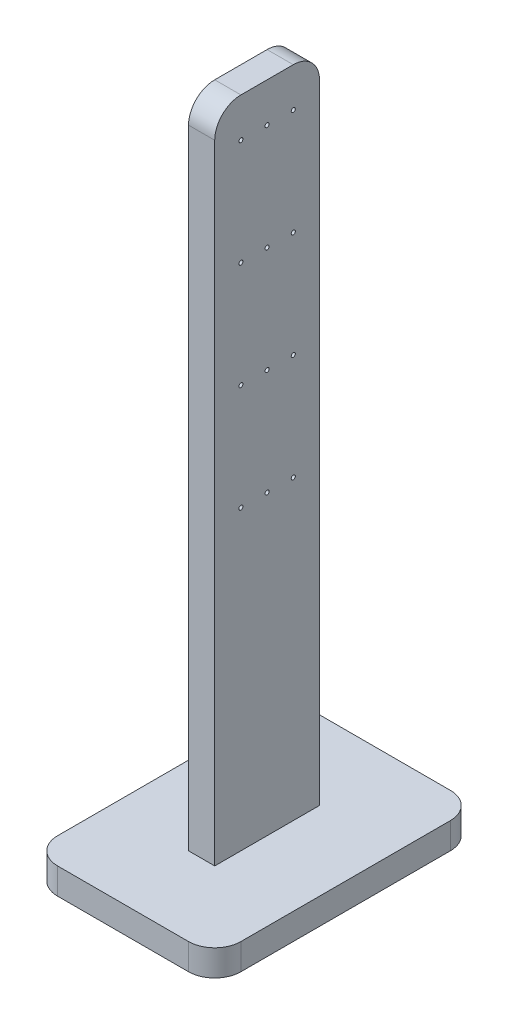
ISO-10303-21;
HEADER;
FILE_DESCRIPTION(('STEP AP214'),'2;1');
FILE_NAME('part.step','',(''),(''),'','','');
FILE_SCHEMA(('AUTOMOTIVE_DESIGN { 1 0 10303 214 1 1 1 1 }'));
ENDSEC;
DATA;
#1=APPLICATION_CONTEXT('core data for automotive mechanical design processes');
#2=APPLICATION_PROTOCOL_DEFINITION('international standard','automotive_design',2000,#1);
#3=PRODUCT_CONTEXT('',#1,'mechanical');
#4=PRODUCT('Part','Part','',(#3));
#5=PRODUCT_RELATED_PRODUCT_CATEGORY('part','',(#4));
#6=PRODUCT_DEFINITION_FORMATION('','',#4);
#7=PRODUCT_DEFINITION_CONTEXT('part definition',#1,'design');
#8=PRODUCT_DEFINITION('design','',#6,#7);
#9=PRODUCT_DEFINITION_SHAPE('','',#8);
#10=(LENGTH_UNIT() NAMED_UNIT(*) SI_UNIT(.MILLI.,.METRE.));
#11=(NAMED_UNIT(*) PLANE_ANGLE_UNIT() SI_UNIT($,.RADIAN.));
#12=(NAMED_UNIT(*) SI_UNIT($,.STERADIAN.) SOLID_ANGLE_UNIT());
#13=UNCERTAINTY_MEASURE_WITH_UNIT(LENGTH_MEASURE(1.E-05),#10,'distance_accuracy_value','');
#14=(GEOMETRIC_REPRESENTATION_CONTEXT(3) GLOBAL_UNCERTAINTY_ASSIGNED_CONTEXT((#13)) GLOBAL_UNIT_ASSIGNED_CONTEXT((#10,
#11,#12)) REPRESENTATION_CONTEXT('',''));
#15=CARTESIAN_POINT('',(0.,0.,0.));
#16=DIRECTION('',(0.,0.,1.));
#17=DIRECTION('',(1.,0.,0.));
#18=AXIS2_PLACEMENT_3D('',#15,#16,#17);
#19=CARTESIAN_POINT('',(10.,240.,-10.));
#20=DIRECTION('',(-1.,0.,0.));
#21=DIRECTION('',(0.,0.,1.));
#22=AXIS2_PLACEMENT_3D('',#19,#20,#21);
#23=PLANE('',#22);
#24=DIRECTION('',(0.,-1.,0.));
#25=VECTOR('',#24,1.);
#26=CARTESIAN_POINT('',(10.,0.,0.));
#27=LINE('',#26,#25);
#28=CARTESIAN_POINT('',(10.,240.,0.));
#29=VERTEX_POINT('',#28);
#30=CARTESIAN_POINT('',(10.,0.,0.));
#31=VERTEX_POINT('',#30);
#32=EDGE_CURVE('E90',#29,#31,#27,.T.);
#33=ORIENTED_EDGE('',*,*,#32,.T.);
#34=DIRECTION('',(0.,0.,-1.));
#35=VECTOR('',#34,1.);
#36=CARTESIAN_POINT('',(10.,0.,0.));
#37=LINE('',#36,#35);
#38=CARTESIAN_POINT('',(10.,0.,-40.));
#39=VERTEX_POINT('',#38);
#40=EDGE_CURVE('E150',#31,#39,#37,.T.);
#41=ORIENTED_EDGE('',*,*,#40,.T.);
#42=DIRECTION('',(0.,1.,0.));
#43=VECTOR('',#42,1.);
#44=CARTESIAN_POINT('',(10.,0.,-40.));
#45=LINE('',#44,#43);
#46=CARTESIAN_POINT('',(10.,240.,-40.));
#47=VERTEX_POINT('',#46);
#48=EDGE_CURVE('E106',#39,#47,#45,.T.);
#49=ORIENTED_EDGE('',*,*,#48,.T.);
#50=CARTESIAN_POINT('',(10.,240.,-30.));
#51=DIRECTION('',(1.,0.,0.));
#52=DIRECTION('',(0.,0.,1.));
#53=AXIS2_PLACEMENT_3D('',#50,#51,#52);
#54=CIRCLE('',#53,10.);
#55=CARTESIAN_POINT('',(10.,250.,-29.9999999999999));
#56=VERTEX_POINT('',#55);
#57=EDGE_CURVE('E100',#47,#56,#54,.T.);
#58=ORIENTED_EDGE('',*,*,#57,.T.);
#59=DIRECTION('',(0.,0.,1.));
#60=VECTOR('',#59,1.);
#61=CARTESIAN_POINT('',(10.,250.,-10.0000000000001));
#62=LINE('',#61,#60);
#63=CARTESIAN_POINT('',(10.,250.,-10.0000000000001));
#64=VERTEX_POINT('',#63);
#65=EDGE_CURVE('E104',#56,#64,#62,.T.);
#66=ORIENTED_EDGE('',*,*,#65,.T.);
#67=CARTESIAN_POINT('',(10.,240.,-10.));
#68=DIRECTION('',(1.,0.,0.));
#69=DIRECTION('',(0.,0.,1.));
#70=AXIS2_PLACEMENT_3D('',#67,#68,#69);
#71=CIRCLE('',#70,10.);
#72=EDGE_CURVE('E57',#64,#29,#71,.T.);
#73=ORIENTED_EDGE('',*,*,#72,.T.);
#74=EDGE_LOOP('',(#33,#41,#49,#58,#66,#73));
#75=FACE_BOUND('',#74,.T.);
#76=CARTESIAN_POINT('',(10.,235.,-10.));
#77=DIRECTION('',(1.,0.,0.));
#78=DIRECTION('',(0.,0.,-1.));
#79=AXIS2_PLACEMENT_3D('',#76,#77,#78);
#80=CIRCLE('',#79,0.783500000000003);
#81=CARTESIAN_POINT('',(10.,235.,-10.7835));
#82=VERTEX_POINT('',#81);
#83=EDGE_CURVE('E128',#82,#82,#80,.T.);
#84=ORIENTED_EDGE('',*,*,#83,.F.);
#85=EDGE_LOOP('',(#84));
#86=FACE_BOUND('',#85,.T.);
#87=CARTESIAN_POINT('',(10.,235.,-20.));
#88=DIRECTION('',(1.,0.,0.));
#89=DIRECTION('',(0.,0.,-1.));
#90=AXIS2_PLACEMENT_3D('',#87,#88,#89);
#91=CIRCLE('',#90,0.783500000000001);
#92=CARTESIAN_POINT('',(10.,235.,-20.7835));
#93=VERTEX_POINT('',#92);
#94=EDGE_CURVE('E352',#93,#93,#91,.T.);
#95=ORIENTED_EDGE('',*,*,#94,.F.);
#96=EDGE_LOOP('',(#95));
#97=FACE_BOUND('',#96,.T.);
#98=CARTESIAN_POINT('',(10.,235.,-30.));
#99=DIRECTION('',(1.,0.,0.));
#100=DIRECTION('',(0.,0.,-1.));
#101=AXIS2_PLACEMENT_3D('',#98,#99,#100);
#102=CIRCLE('',#101,0.783500000000001);
#103=CARTESIAN_POINT('',(10.,235.,-30.7835));
#104=VERTEX_POINT('',#103);
#105=EDGE_CURVE('E346',#104,#104,#102,.T.);
#106=ORIENTED_EDGE('',*,*,#105,.F.);
#107=EDGE_LOOP('',(#106));
#108=FACE_BOUND('',#107,.T.);
#109=CARTESIAN_POINT('',(10.,113.5,-10.0000000000013));
#110=DIRECTION('',(1.,0.,0.));
#111=DIRECTION('',(0.,0.,-1.));
#112=AXIS2_PLACEMENT_3D('',#109,#110,#111);
#113=CIRCLE('',#112,0.783499999999999);
#114=CARTESIAN_POINT('',(10.,113.5,-10.7835000000013));
#115=VERTEX_POINT('',#114);
#116=EDGE_CURVE('E340',#115,#115,#113,.T.);
#117=ORIENTED_EDGE('',*,*,#116,.F.);
#118=EDGE_LOOP('',(#117));
#119=FACE_BOUND('',#118,.T.);
#120=CARTESIAN_POINT('',(10.,194.5,-10.0000000000004));
#121=DIRECTION('',(1.,0.,0.));
#122=DIRECTION('',(0.,0.,-1.));
#123=AXIS2_PLACEMENT_3D('',#120,#121,#122);
#124=CIRCLE('',#123,0.783500000000003);
#125=CARTESIAN_POINT('',(10.,194.5,-10.7835000000004));
#126=VERTEX_POINT('',#125);
#127=EDGE_CURVE('E334',#126,#126,#124,.T.);
#128=ORIENTED_EDGE('',*,*,#127,.F.);
#129=EDGE_LOOP('',(#128));
#130=FACE_BOUND('',#129,.T.);
#131=CARTESIAN_POINT('',(10.,194.5,-20.0000000000004));
#132=DIRECTION('',(1.,0.,0.));
#133=DIRECTION('',(0.,0.,-1.));
#134=AXIS2_PLACEMENT_3D('',#131,#132,#133);
#135=CIRCLE('',#134,0.783500000000001);
#136=CARTESIAN_POINT('',(10.,194.5,-20.7835000000004));
#137=VERTEX_POINT('',#136);
#138=EDGE_CURVE('E328',#137,#137,#135,.T.);
#139=ORIENTED_EDGE('',*,*,#138,.F.);
#140=EDGE_LOOP('',(#139));
#141=FACE_BOUND('',#140,.T.);
#142=CARTESIAN_POINT('',(10.,194.5,-30.0000000000004));
#143=DIRECTION('',(1.,0.,0.));
#144=DIRECTION('',(0.,0.,-1.));
#145=AXIS2_PLACEMENT_3D('',#142,#143,#144);
#146=CIRCLE('',#145,0.783500000000001);
#147=CARTESIAN_POINT('',(10.,194.5,-30.7835000000004));
#148=VERTEX_POINT('',#147);
#149=EDGE_CURVE('E322',#148,#148,#146,.T.);
#150=ORIENTED_EDGE('',*,*,#149,.F.);
#151=EDGE_LOOP('',(#150));
#152=FACE_BOUND('',#151,.T.);
#153=CARTESIAN_POINT('',(10.,154.,-10.0000000000008));
#154=DIRECTION('',(1.,0.,0.));
#155=DIRECTION('',(0.,0.,-1.));
#156=AXIS2_PLACEMENT_3D('',#153,#154,#155);
#157=CIRCLE('',#156,0.783500000000003);
#158=CARTESIAN_POINT('',(10.,154.,-10.7835000000008));
#159=VERTEX_POINT('',#158);
#160=EDGE_CURVE('E316',#159,#159,#157,.T.);
#161=ORIENTED_EDGE('',*,*,#160,.F.);
#162=EDGE_LOOP('',(#161));
#163=FACE_BOUND('',#162,.T.);
#164=CARTESIAN_POINT('',(10.,154.,-20.0000000000008));
#165=DIRECTION('',(1.,0.,0.));
#166=DIRECTION('',(0.,0.,-1.));
#167=AXIS2_PLACEMENT_3D('',#164,#165,#166);
#168=CIRCLE('',#167,0.783500000000001);
#169=CARTESIAN_POINT('',(10.,154.,-20.7835000000008));
#170=VERTEX_POINT('',#169);
#171=EDGE_CURVE('E310',#170,#170,#168,.T.);
#172=ORIENTED_EDGE('',*,*,#171,.F.);
#173=EDGE_LOOP('',(#172));
#174=FACE_BOUND('',#173,.T.);
#175=CARTESIAN_POINT('',(10.,154.,-30.0000000000008));
#176=DIRECTION('',(1.,0.,0.));
#177=DIRECTION('',(0.,0.,-1.));
#178=AXIS2_PLACEMENT_3D('',#175,#176,#177);
#179=CIRCLE('',#178,0.783500000000001);
#180=CARTESIAN_POINT('',(10.,154.,-30.7835000000008));
#181=VERTEX_POINT('',#180);
#182=EDGE_CURVE('E304',#181,#181,#179,.T.);
#183=ORIENTED_EDGE('',*,*,#182,.F.);
#184=EDGE_LOOP('',(#183));
#185=FACE_BOUND('',#184,.T.);
#186=CARTESIAN_POINT('',(10.,113.5,-20.0000000000013));
#187=DIRECTION('',(1.,0.,0.));
#188=DIRECTION('',(0.,0.,-1.));
#189=AXIS2_PLACEMENT_3D('',#186,#187,#188);
#190=CIRCLE('',#189,0.783499999999997);
#191=CARTESIAN_POINT('',(10.,113.5,-20.7835000000013));
#192=VERTEX_POINT('',#191);
#193=EDGE_CURVE('E298',#192,#192,#190,.T.);
#194=ORIENTED_EDGE('',*,*,#193,.F.);
#195=EDGE_LOOP('',(#194));
#196=FACE_BOUND('',#195,.T.);
#197=CARTESIAN_POINT('',(10.,113.5,-30.0000000000013));
#198=DIRECTION('',(1.,0.,0.));
#199=DIRECTION('',(0.,0.,-1.));
#200=AXIS2_PLACEMENT_3D('',#197,#198,#199);
#201=CIRCLE('',#200,0.783499999999997);
#202=CARTESIAN_POINT('',(10.,113.5,-30.7835000000013));
#203=VERTEX_POINT('',#202);
#204=EDGE_CURVE('E288',#203,#203,#201,.T.);
#205=ORIENTED_EDGE('',*,*,#204,.F.);
#206=EDGE_LOOP('',(#205));
#207=FACE_BOUND('',#206,.T.);
#208=ADVANCED_FACE('F40',(#75,#86,#97,#108,#119,#130,#141,#152,#163,#174,#185,#196,#207),#23,.F.);
#209=CARTESIAN_POINT('',(0.,240.,-10.));
#210=DIRECTION('',(-1.,0.,0.));
#211=DIRECTION('',(0.,0.,1.));
#212=AXIS2_PLACEMENT_3D('',#209,#210,#211);
#213=PLANE('',#212);
#214=CARTESIAN_POINT('',(0.,113.5,-20.0000000000013));
#215=DIRECTION('',(1.,0.,0.));
#216=DIRECTION('',(0.,0.,-1.));
#217=AXIS2_PLACEMENT_3D('',#214,#215,#216);
#218=CIRCLE('',#217,0.783499999999997);
#219=CARTESIAN_POINT('',(0.,113.5,-20.7835000000013));
#220=VERTEX_POINT('',#219);
#221=EDGE_CURVE('E296',#220,#220,#218,.T.);
#222=ORIENTED_EDGE('',*,*,#221,.T.);
#223=EDGE_LOOP('',(#222));
#224=FACE_BOUND('',#223,.T.);
#225=CARTESIAN_POINT('',(0.,154.,-20.0000000000008));
#226=DIRECTION('',(1.,0.,0.));
#227=DIRECTION('',(0.,0.,-1.));
#228=AXIS2_PLACEMENT_3D('',#225,#226,#227);
#229=CIRCLE('',#228,0.783500000000001);
#230=CARTESIAN_POINT('',(0.,154.,-20.7835000000008));
#231=VERTEX_POINT('',#230);
#232=EDGE_CURVE('E307',#231,#231,#229,.T.);
#233=ORIENTED_EDGE('',*,*,#232,.T.);
#234=EDGE_LOOP('',(#233));
#235=FACE_BOUND('',#234,.T.);
#236=CARTESIAN_POINT('',(0.,194.5,-30.0000000000004));
#237=DIRECTION('',(1.,0.,0.));
#238=DIRECTION('',(0.,0.,-1.));
#239=AXIS2_PLACEMENT_3D('',#236,#237,#238);
#240=CIRCLE('',#239,0.783500000000001);
#241=CARTESIAN_POINT('',(0.,194.5,-30.7835000000004));
#242=VERTEX_POINT('',#241);
#243=EDGE_CURVE('E319',#242,#242,#240,.T.);
#244=ORIENTED_EDGE('',*,*,#243,.T.);
#245=EDGE_LOOP('',(#244));
#246=FACE_BOUND('',#245,.T.);
#247=CARTESIAN_POINT('',(0.,194.5,-10.0000000000004));
#248=DIRECTION('',(1.,0.,0.));
#249=DIRECTION('',(0.,0.,-1.));
#250=AXIS2_PLACEMENT_3D('',#247,#248,#249);
#251=CIRCLE('',#250,0.783500000000003);
#252=CARTESIAN_POINT('',(0.,194.5,-10.7835000000004));
#253=VERTEX_POINT('',#252);
#254=EDGE_CURVE('E331',#253,#253,#251,.T.);
#255=ORIENTED_EDGE('',*,*,#254,.T.);
#256=EDGE_LOOP('',(#255));
#257=FACE_BOUND('',#256,.T.);
#258=CARTESIAN_POINT('',(0.,235.,-30.));
#259=DIRECTION('',(1.,0.,0.));
#260=DIRECTION('',(0.,0.,-1.));
#261=AXIS2_PLACEMENT_3D('',#258,#259,#260);
#262=CIRCLE('',#261,0.783500000000001);
#263=CARTESIAN_POINT('',(0.,235.,-30.7835));
#264=VERTEX_POINT('',#263);
#265=EDGE_CURVE('E343',#264,#264,#262,.T.);
#266=ORIENTED_EDGE('',*,*,#265,.T.);
#267=EDGE_LOOP('',(#266));
#268=FACE_BOUND('',#267,.T.);
#269=CARTESIAN_POINT('',(0.,235.,-10.));
#270=DIRECTION('',(1.,0.,0.));
#271=DIRECTION('',(0.,0.,-1.));
#272=AXIS2_PLACEMENT_3D('',#269,#270,#271);
#273=CIRCLE('',#272,0.783500000000003);
#274=CARTESIAN_POINT('',(0.,235.,-10.7835));
#275=VERTEX_POINT('',#274);
#276=EDGE_CURVE('E355',#275,#275,#273,.T.);
#277=ORIENTED_EDGE('',*,*,#276,.T.);
#278=EDGE_LOOP('',(#277));
#279=FACE_BOUND('',#278,.T.);
#280=DIRECTION('',(0.,-1.,0.));
#281=VECTOR('',#280,1.);
#282=CARTESIAN_POINT('',(0.,0.,0.));
#283=LINE('',#282,#281);
#284=CARTESIAN_POINT('',(0.,240.,0.));
#285=VERTEX_POINT('',#284);
#286=CARTESIAN_POINT('',(0.,0.,0.));
#287=VERTEX_POINT('',#286);
#288=EDGE_CURVE('E124',#285,#287,#283,.T.);
#289=ORIENTED_EDGE('',*,*,#288,.F.);
#290=CARTESIAN_POINT('',(0.,240.,-10.));
#291=DIRECTION('',(1.,0.,0.));
#292=DIRECTION('',(0.,0.,1.));
#293=AXIS2_PLACEMENT_3D('',#290,#291,#292);
#294=CIRCLE('',#293,10.);
#295=CARTESIAN_POINT('',(0.,250.,-10.0000000000001));
#296=VERTEX_POINT('',#295);
#297=EDGE_CURVE('E84',#296,#285,#294,.T.);
#298=ORIENTED_EDGE('',*,*,#297,.F.);
#299=DIRECTION('',(0.,0.,1.));
#300=VECTOR('',#299,1.);
#301=CARTESIAN_POINT('',(0.,250.,-10.0000000000001));
#302=LINE('',#301,#300);
#303=CARTESIAN_POINT('',(0.,250.,-29.9999999999999));
#304=VERTEX_POINT('',#303);
#305=EDGE_CURVE('E78',#304,#296,#302,.T.);
#306=ORIENTED_EDGE('',*,*,#305,.F.);
#307=CARTESIAN_POINT('',(0.,240.,-30.));
#308=DIRECTION('',(1.,0.,0.));
#309=DIRECTION('',(0.,0.,1.));
#310=AXIS2_PLACEMENT_3D('',#307,#308,#309);
#311=CIRCLE('',#310,10.);
#312=CARTESIAN_POINT('',(0.,240.,-40.));
#313=VERTEX_POINT('',#312);
#314=EDGE_CURVE('E114',#313,#304,#311,.T.);
#315=ORIENTED_EDGE('',*,*,#314,.F.);
#316=DIRECTION('',(0.,1.,0.));
#317=VECTOR('',#316,1.);
#318=CARTESIAN_POINT('',(0.,0.,-40.));
#319=LINE('',#318,#317);
#320=CARTESIAN_POINT('',(0.,0.,-40.));
#321=VERTEX_POINT('',#320);
#322=EDGE_CURVE('E131',#321,#313,#319,.T.);
#323=ORIENTED_EDGE('',*,*,#322,.F.);
#324=DIRECTION('',(0.,0.,-1.));
#325=VECTOR('',#324,1.);
#326=CARTESIAN_POINT('',(0.,0.,0.));
#327=LINE('',#326,#325);
#328=EDGE_CURVE('E127',#287,#321,#327,.T.);
#329=ORIENTED_EDGE('',*,*,#328,.F.);
#330=EDGE_LOOP('',(#289,#298,#306,#315,#323,#329));
#331=FACE_BOUND('',#330,.T.);
#332=CARTESIAN_POINT('',(0.,235.,-20.));
#333=DIRECTION('',(1.,0.,0.));
#334=DIRECTION('',(0.,0.,-1.));
#335=AXIS2_PLACEMENT_3D('',#332,#333,#334);
#336=CIRCLE('',#335,0.783500000000001);
#337=CARTESIAN_POINT('',(0.,235.,-20.7835));
#338=VERTEX_POINT('',#337);
#339=EDGE_CURVE('E349',#338,#338,#336,.T.);
#340=ORIENTED_EDGE('',*,*,#339,.T.);
#341=EDGE_LOOP('',(#340));
#342=FACE_BOUND('',#341,.T.);
#343=CARTESIAN_POINT('',(0.,113.5,-10.0000000000013));
#344=DIRECTION('',(1.,0.,0.));
#345=DIRECTION('',(0.,0.,-1.));
#346=AXIS2_PLACEMENT_3D('',#343,#344,#345);
#347=CIRCLE('',#346,0.783499999999999);
#348=CARTESIAN_POINT('',(0.,113.5,-10.7835000000013));
#349=VERTEX_POINT('',#348);
#350=EDGE_CURVE('E337',#349,#349,#347,.T.);
#351=ORIENTED_EDGE('',*,*,#350,.T.);
#352=EDGE_LOOP('',(#351));
#353=FACE_BOUND('',#352,.T.);
#354=CARTESIAN_POINT('',(0.,194.5,-20.0000000000004));
#355=DIRECTION('',(1.,0.,0.));
#356=DIRECTION('',(0.,0.,-1.));
#357=AXIS2_PLACEMENT_3D('',#354,#355,#356);
#358=CIRCLE('',#357,0.783500000000001);
#359=CARTESIAN_POINT('',(0.,194.5,-20.7835000000004));
#360=VERTEX_POINT('',#359);
#361=EDGE_CURVE('E325',#360,#360,#358,.T.);
#362=ORIENTED_EDGE('',*,*,#361,.T.);
#363=EDGE_LOOP('',(#362));
#364=FACE_BOUND('',#363,.T.);
#365=CARTESIAN_POINT('',(0.,154.,-10.0000000000008));
#366=DIRECTION('',(1.,0.,0.));
#367=DIRECTION('',(0.,0.,-1.));
#368=AXIS2_PLACEMENT_3D('',#365,#366,#367);
#369=CIRCLE('',#368,0.783500000000003);
#370=CARTESIAN_POINT('',(0.,154.,-10.7835000000008));
#371=VERTEX_POINT('',#370);
#372=EDGE_CURVE('E313',#371,#371,#369,.T.);
#373=ORIENTED_EDGE('',*,*,#372,.T.);
#374=EDGE_LOOP('',(#373));
#375=FACE_BOUND('',#374,.T.);
#376=CARTESIAN_POINT('',(0.,154.,-30.0000000000008));
#377=DIRECTION('',(1.,0.,0.));
#378=DIRECTION('',(0.,0.,-1.));
#379=AXIS2_PLACEMENT_3D('',#376,#377,#378);
#380=CIRCLE('',#379,0.783500000000001);
#381=CARTESIAN_POINT('',(0.,154.,-30.7835000000008));
#382=VERTEX_POINT('',#381);
#383=EDGE_CURVE('E301',#382,#382,#380,.T.);
#384=ORIENTED_EDGE('',*,*,#383,.T.);
#385=EDGE_LOOP('',(#384));
#386=FACE_BOUND('',#385,.T.);
#387=CARTESIAN_POINT('',(0.,113.5,-30.0000000000013));
#388=DIRECTION('',(1.,0.,0.));
#389=DIRECTION('',(0.,0.,-1.));
#390=AXIS2_PLACEMENT_3D('',#387,#388,#389);
#391=CIRCLE('',#390,0.783499999999997);
#392=CARTESIAN_POINT('',(0.,113.5,-30.7835000000013));
#393=VERTEX_POINT('',#392);
#394=EDGE_CURVE('E284',#393,#393,#391,.T.);
#395=ORIENTED_EDGE('',*,*,#394,.T.);
#396=EDGE_LOOP('',(#395));
#397=FACE_BOUND('',#396,.T.);
#398=ADVANCED_FACE('F147',(#224,#235,#246,#257,#268,#279,#331,#342,#353,#364,#375,#386,#397),
#213,.T.);
#399=CARTESIAN_POINT('',(10.,0.,0.));
#400=DIRECTION('',(0.,0.,-1.));
#401=DIRECTION('',(-1.,0.,0.));
#402=AXIS2_PLACEMENT_3D('',#399,#400,#401);
#403=PLANE('',#402);
#404=ORIENTED_EDGE('',*,*,#288,.T.);
#405=DIRECTION('',(-1.,0.,0.));
#406=VECTOR('',#405,1.);
#407=CARTESIAN_POINT('',(10.,0.,0.));
#408=LINE('',#407,#406);
#409=EDGE_CURVE('E11',#31,#287,#408,.T.);
#410=ORIENTED_EDGE('',*,*,#409,.F.);
#411=ORIENTED_EDGE('',*,*,#32,.F.);
#412=DIRECTION('',(-1.,0.,0.));
#413=VECTOR('',#412,1.);
#414=CARTESIAN_POINT('',(10.,240.,0.));
#415=LINE('',#414,#413);
#416=EDGE_CURVE('E120',#29,#285,#415,.T.);
#417=ORIENTED_EDGE('',*,*,#416,.T.);
#418=EDGE_LOOP('',(#404,#410,#411,#417));
#419=FACE_BOUND('',#418,.T.);
#420=ADVANCED_FACE('F42',(#419),#403,.F.);
#421=CARTESIAN_POINT('',(10.,0.,-40.));
#422=DIRECTION('',(0.,0.,1.));
#423=DIRECTION('',(1.,0.,0.));
#424=AXIS2_PLACEMENT_3D('',#421,#422,#423);
#425=PLANE('',#424);
#426=ORIENTED_EDGE('',*,*,#322,.T.);
#427=DIRECTION('',(-1.,0.,0.));
#428=VECTOR('',#427,1.);
#429=CARTESIAN_POINT('',(10.,240.,-40.));
#430=LINE('',#429,#428);
#431=EDGE_CURVE('E115',#47,#313,#430,.T.);
#432=ORIENTED_EDGE('',*,*,#431,.F.);
#433=ORIENTED_EDGE('',*,*,#48,.F.);
#434=DIRECTION('',(-1.,0.,0.));
#435=VECTOR('',#434,1.);
#436=CARTESIAN_POINT('',(10.,0.,-40.));
#437=LINE('',#436,#435);
#438=EDGE_CURVE('E49',#39,#321,#437,.T.);
#439=ORIENTED_EDGE('',*,*,#438,.T.);
#440=EDGE_LOOP('',(#426,#432,#433,#439));
#441=FACE_BOUND('',#440,.T.);
#442=ADVANCED_FACE('F141',(#441),#425,.F.);
#443=CARTESIAN_POINT('',(10.,240.,-30.));
#444=DIRECTION('',(-1.,0.,0.));
#445=DIRECTION('',(0.,0.,1.));
#446=AXIS2_PLACEMENT_3D('',#443,#444,#445);
#447=CYLINDRICAL_SURFACE('',#446,10.);
#448=ORIENTED_EDGE('',*,*,#314,.T.);
#449=DIRECTION('',(-1.,0.,0.));
#450=VECTOR('',#449,1.);
#451=CARTESIAN_POINT('',(10.,250.,-29.9999999999999));
#452=LINE('',#451,#450);
#453=EDGE_CURVE('E111',#56,#304,#452,.T.);
#454=ORIENTED_EDGE('',*,*,#453,.F.);
#455=ORIENTED_EDGE('',*,*,#57,.F.);
#456=ORIENTED_EDGE('',*,*,#431,.T.);
#457=EDGE_LOOP('',(#448,#454,#455,#456));
#458=FACE_BOUND('',#457,.T.);
#459=ADVANCED_FACE('F112',(#458),#447,.T.);
#460=CARTESIAN_POINT('',(10.,250.,-10.0000000000001));
#461=DIRECTION('',(0.,-1.,0.));
#462=DIRECTION('',(0.,0.,-1.));
#463=AXIS2_PLACEMENT_3D('',#460,#461,#462);
#464=PLANE('',#463);
#465=ORIENTED_EDGE('',*,*,#305,.T.);
#466=DIRECTION('',(-1.,0.,0.));
#467=VECTOR('',#466,1.);
#468=CARTESIAN_POINT('',(10.,250.,-10.0000000000001));
#469=LINE('',#468,#467);
#470=EDGE_CURVE('E116',#64,#296,#469,.T.);
#471=ORIENTED_EDGE('',*,*,#470,.F.);
#472=ORIENTED_EDGE('',*,*,#65,.F.);
#473=ORIENTED_EDGE('',*,*,#453,.T.);
#474=EDGE_LOOP('',(#465,#471,#472,#473));
#475=FACE_BOUND('',#474,.T.);
#476=ADVANCED_FACE('F118',(#475),#464,.F.);
#477=CARTESIAN_POINT('',(10.,240.,-10.));
#478=DIRECTION('',(-1.,0.,0.));
#479=DIRECTION('',(0.,0.,1.));
#480=AXIS2_PLACEMENT_3D('',#477,#478,#479);
#481=CYLINDRICAL_SURFACE('',#480,10.);
#482=ORIENTED_EDGE('',*,*,#297,.T.);
#483=ORIENTED_EDGE('',*,*,#416,.F.);
#484=ORIENTED_EDGE('',*,*,#72,.F.);
#485=ORIENTED_EDGE('',*,*,#470,.T.);
#486=EDGE_LOOP('',(#482,#483,#484,#485));
#487=FACE_BOUND('',#486,.T.);
#488=ADVANCED_FACE('F153',(#487),#481,.T.);
#489=CARTESIAN_POINT('',(10.,235.,-10.));
#490=DIRECTION('',(-1.,0.,0.));
#491=DIRECTION('',(0.,0.,1.));
#492=AXIS2_PLACEMENT_3D('',#489,#490,#491);
#493=CYLINDRICAL_SURFACE('',#492,0.783500000000003);
#494=ORIENTED_EDGE('',*,*,#83,.T.);
#495=EDGE_LOOP('',(#494));
#496=FACE_BOUND('',#495,.T.);
#497=ORIENTED_EDGE('',*,*,#276,.F.);
#498=EDGE_LOOP('',(#497));
#499=FACE_BOUND('',#498,.T.);
#500=ADVANCED_FACE('F155',(#496,#499),#493,.F.);
#501=CARTESIAN_POINT('',(10.,235.,-20.));
#502=DIRECTION('',(-1.,0.,0.));
#503=DIRECTION('',(0.,0.,1.));
#504=AXIS2_PLACEMENT_3D('',#501,#502,#503);
#505=CYLINDRICAL_SURFACE('',#504,0.783500000000001);
#506=ORIENTED_EDGE('',*,*,#94,.T.);
#507=EDGE_LOOP('',(#506));
#508=FACE_BOUND('',#507,.T.);
#509=ORIENTED_EDGE('',*,*,#339,.F.);
#510=EDGE_LOOP('',(#509));
#511=FACE_BOUND('',#510,.T.);
#512=ADVANCED_FACE('F161',(#508,#511),#505,.F.);
#513=CARTESIAN_POINT('',(10.,235.,-30.));
#514=DIRECTION('',(-1.,0.,0.));
#515=DIRECTION('',(0.,0.,1.));
#516=AXIS2_PLACEMENT_3D('',#513,#514,#515);
#517=CYLINDRICAL_SURFACE('',#516,0.783500000000001);
#518=ORIENTED_EDGE('',*,*,#105,.T.);
#519=EDGE_LOOP('',(#518));
#520=FACE_BOUND('',#519,.T.);
#521=ORIENTED_EDGE('',*,*,#265,.F.);
#522=EDGE_LOOP('',(#521));
#523=FACE_BOUND('',#522,.T.);
#524=ADVANCED_FACE('F175',(#520,#523),#517,.F.);
#525=CARTESIAN_POINT('',(10.,113.5,-10.0000000000013));
#526=DIRECTION('',(-1.,0.,0.));
#527=DIRECTION('',(0.,0.,1.));
#528=AXIS2_PLACEMENT_3D('',#525,#526,#527);
#529=CYLINDRICAL_SURFACE('',#528,0.783499999999999);
#530=ORIENTED_EDGE('',*,*,#116,.T.);
#531=EDGE_LOOP('',(#530));
#532=FACE_BOUND('',#531,.T.);
#533=ORIENTED_EDGE('',*,*,#350,.F.);
#534=EDGE_LOOP('',(#533));
#535=FACE_BOUND('',#534,.T.);
#536=ADVANCED_FACE('F179',(#532,#535),#529,.F.);
#537=CARTESIAN_POINT('',(10.,194.5,-10.0000000000004));
#538=DIRECTION('',(-1.,0.,0.));
#539=DIRECTION('',(0.,0.,1.));
#540=AXIS2_PLACEMENT_3D('',#537,#538,#539);
#541=CYLINDRICAL_SURFACE('',#540,0.783500000000003);
#542=ORIENTED_EDGE('',*,*,#127,.T.);
#543=EDGE_LOOP('',(#542));
#544=FACE_BOUND('',#543,.T.);
#545=ORIENTED_EDGE('',*,*,#254,.F.);
#546=EDGE_LOOP('',(#545));
#547=FACE_BOUND('',#546,.T.);
#548=ADVANCED_FACE('F183',(#544,#547),#541,.F.);
#549=CARTESIAN_POINT('',(10.,194.5,-20.0000000000004));
#550=DIRECTION('',(-1.,0.,0.));
#551=DIRECTION('',(0.,0.,1.));
#552=AXIS2_PLACEMENT_3D('',#549,#550,#551);
#553=CYLINDRICAL_SURFACE('',#552,0.783500000000001);
#554=ORIENTED_EDGE('',*,*,#138,.T.);
#555=EDGE_LOOP('',(#554));
#556=FACE_BOUND('',#555,.T.);
#557=ORIENTED_EDGE('',*,*,#361,.F.);
#558=EDGE_LOOP('',(#557));
#559=FACE_BOUND('',#558,.T.);
#560=ADVANCED_FACE('F187',(#556,#559),#553,.F.);
#561=CARTESIAN_POINT('',(10.,194.5,-30.0000000000004));
#562=DIRECTION('',(-1.,0.,0.));
#563=DIRECTION('',(0.,0.,1.));
#564=AXIS2_PLACEMENT_3D('',#561,#562,#563);
#565=CYLINDRICAL_SURFACE('',#564,0.783500000000001);
#566=ORIENTED_EDGE('',*,*,#149,.T.);
#567=EDGE_LOOP('',(#566));
#568=FACE_BOUND('',#567,.T.);
#569=ORIENTED_EDGE('',*,*,#243,.F.);
#570=EDGE_LOOP('',(#569));
#571=FACE_BOUND('',#570,.T.);
#572=ADVANCED_FACE('F191',(#568,#571),#565,.F.);
#573=CARTESIAN_POINT('',(10.,154.,-10.0000000000008));
#574=DIRECTION('',(-1.,0.,0.));
#575=DIRECTION('',(0.,0.,1.));
#576=AXIS2_PLACEMENT_3D('',#573,#574,#575);
#577=CYLINDRICAL_SURFACE('',#576,0.783500000000003);
#578=ORIENTED_EDGE('',*,*,#160,.T.);
#579=EDGE_LOOP('',(#578));
#580=FACE_BOUND('',#579,.T.);
#581=ORIENTED_EDGE('',*,*,#372,.F.);
#582=EDGE_LOOP('',(#581));
#583=FACE_BOUND('',#582,.T.);
#584=ADVANCED_FACE('F195',(#580,#583),#577,.F.);
#585=CARTESIAN_POINT('',(10.,154.,-20.0000000000008));
#586=DIRECTION('',(-1.,0.,0.));
#587=DIRECTION('',(0.,0.,1.));
#588=AXIS2_PLACEMENT_3D('',#585,#586,#587);
#589=CYLINDRICAL_SURFACE('',#588,0.783500000000001);
#590=ORIENTED_EDGE('',*,*,#171,.T.);
#591=EDGE_LOOP('',(#590));
#592=FACE_BOUND('',#591,.T.);
#593=ORIENTED_EDGE('',*,*,#232,.F.);
#594=EDGE_LOOP('',(#593));
#595=FACE_BOUND('',#594,.T.);
#596=ADVANCED_FACE('F199',(#592,#595),#589,.F.);
#597=CARTESIAN_POINT('',(10.,154.,-30.0000000000008));
#598=DIRECTION('',(-1.,0.,0.));
#599=DIRECTION('',(0.,0.,1.));
#600=AXIS2_PLACEMENT_3D('',#597,#598,#599);
#601=CYLINDRICAL_SURFACE('',#600,0.783500000000001);
#602=ORIENTED_EDGE('',*,*,#182,.T.);
#603=EDGE_LOOP('',(#602));
#604=FACE_BOUND('',#603,.T.);
#605=ORIENTED_EDGE('',*,*,#383,.F.);
#606=EDGE_LOOP('',(#605));
#607=FACE_BOUND('',#606,.T.);
#608=ADVANCED_FACE('F203',(#604,#607),#601,.F.);
#609=CARTESIAN_POINT('',(10.,113.5,-20.0000000000013));
#610=DIRECTION('',(-1.,0.,0.));
#611=DIRECTION('',(0.,0.,1.));
#612=AXIS2_PLACEMENT_3D('',#609,#610,#611);
#613=CYLINDRICAL_SURFACE('',#612,0.783499999999997);
#614=ORIENTED_EDGE('',*,*,#193,.T.);
#615=EDGE_LOOP('',(#614));
#616=FACE_BOUND('',#615,.T.);
#617=ORIENTED_EDGE('',*,*,#221,.F.);
#618=EDGE_LOOP('',(#617));
#619=FACE_BOUND('',#618,.T.);
#620=ADVANCED_FACE('F207',(#616,#619),#613,.F.);
#621=CARTESIAN_POINT('',(10.,113.5,-30.0000000000013));
#622=DIRECTION('',(-1.,0.,0.));
#623=DIRECTION('',(0.,0.,1.));
#624=AXIS2_PLACEMENT_3D('',#621,#622,#623);
#625=CYLINDRICAL_SURFACE('',#624,0.783499999999997);
#626=ORIENTED_EDGE('',*,*,#204,.T.);
#627=EDGE_LOOP('',(#626));
#628=FACE_BOUND('',#627,.T.);
#629=ORIENTED_EDGE('',*,*,#394,.F.);
#630=EDGE_LOOP('',(#629));
#631=FACE_BOUND('',#630,.T.);
#632=ADVANCED_FACE('F211',(#628,#631),#625,.F.);
#633=CARTESIAN_POINT('',(-20.,0.,-60.));
#634=DIRECTION('',(0.,-1.,0.));
#635=DIRECTION('',(0.,0.,-1.));
#636=AXIS2_PLACEMENT_3D('',#633,#634,#635);
#637=PLANE('',#636);
#638=CARTESIAN_POINT('',(-20.,0.,-60.));
#639=DIRECTION('',(0.,-1.,0.));
#640=DIRECTION('',(0.,0.,-1.));
#641=AXIS2_PLACEMENT_3D('',#638,#639,#640);
#642=CIRCLE('',#641,10.);
#643=CARTESIAN_POINT('',(-30.,0.,-59.9999999999999));
#644=VERTEX_POINT('',#643);
#645=CARTESIAN_POINT('',(-19.9999999999999,0.,-70.));
#646=VERTEX_POINT('',#645);
#647=EDGE_CURVE('E282',#644,#646,#642,.T.);
#648=ORIENTED_EDGE('',*,*,#647,.F.);
#649=DIRECTION('',(0.,0.,-1.));
#650=VECTOR('',#649,1.);
#651=CARTESIAN_POINT('',(-30.,0.,19.9999999999999));
#652=LINE('',#651,#650);
#653=CARTESIAN_POINT('',(-30.,0.,19.9999999999999));
#654=VERTEX_POINT('',#653);
#655=EDGE_CURVE('E275',#654,#644,#652,.T.);
#656=ORIENTED_EDGE('',*,*,#655,.F.);
#657=CARTESIAN_POINT('',(-20.,0.,20.));
#658=DIRECTION('',(0.,-1.,0.));
#659=DIRECTION('',(0.,0.,-1.));
#660=AXIS2_PLACEMENT_3D('',#657,#658,#659);
#661=CIRCLE('',#660,10.);
#662=CARTESIAN_POINT('',(-19.9999999999999,0.,30.));
#663=VERTEX_POINT('',#662);
#664=EDGE_CURVE('E438',#663,#654,#661,.T.);
#665=ORIENTED_EDGE('',*,*,#664,.F.);
#666=DIRECTION('',(-1.,0.,0.));
#667=VECTOR('',#666,1.);
#668=CARTESIAN_POINT('',(-19.9999999999999,0.,30.));
#669=LINE('',#668,#667);
#670=CARTESIAN_POINT('',(29.9999999999999,0.,30.));
#671=VERTEX_POINT('',#670);
#672=EDGE_CURVE('E441',#671,#663,#669,.T.);
#673=ORIENTED_EDGE('',*,*,#672,.F.);
#674=CARTESIAN_POINT('',(30.,0.,20.));
#675=DIRECTION('',(0.,-1.,0.));
#676=DIRECTION('',(0.,0.,1.));
#677=AXIS2_PLACEMENT_3D('',#674,#675,#676);
#678=CIRCLE('',#677,10.);
#679=CARTESIAN_POINT('',(40.,0.,19.9999999999999));
#680=VERTEX_POINT('',#679);
#681=EDGE_CURVE('E444',#680,#671,#678,.T.);
#682=ORIENTED_EDGE('',*,*,#681,.F.);
#683=DIRECTION('',(0.,0.,1.));
#684=VECTOR('',#683,1.);
#685=CARTESIAN_POINT('',(40.,0.,19.9999999999999));
#686=LINE('',#685,#684);
#687=CARTESIAN_POINT('',(40.,0.,-59.9999999999999));
#688=VERTEX_POINT('',#687);
#689=EDGE_CURVE('E447',#688,#680,#686,.T.);
#690=ORIENTED_EDGE('',*,*,#689,.F.);
#691=CARTESIAN_POINT('',(30.,0.,-60.));
#692=DIRECTION('',(0.,-1.,0.));
#693=DIRECTION('',(0.,0.,-1.));
#694=AXIS2_PLACEMENT_3D('',#691,#692,#693);
#695=CIRCLE('',#694,10.);
#696=CARTESIAN_POINT('',(30.,0.,-70.));
#697=VERTEX_POINT('',#696);
#698=EDGE_CURVE('E450',#697,#688,#695,.T.);
#699=ORIENTED_EDGE('',*,*,#698,.F.);
#700=DIRECTION('',(1.,0.,0.));
#701=VECTOR('',#700,1.);
#702=CARTESIAN_POINT('',(-19.9999999999999,0.,-70.));
#703=LINE('',#702,#701);
#704=EDGE_CURVE('E453',#646,#697,#703,.T.);
#705=ORIENTED_EDGE('',*,*,#704,.F.);
#706=EDGE_LOOP('',(#648,#656,#665,#673,#682,#690,#699,#705));
#707=FACE_BOUND('',#706,.T.);
#708=ORIENTED_EDGE('',*,*,#409,.T.);
#709=ORIENTED_EDGE('',*,*,#328,.T.);
#710=ORIENTED_EDGE('',*,*,#438,.F.);
#711=ORIENTED_EDGE('',*,*,#40,.F.);
#712=EDGE_LOOP('',(#708,#709,#710,#711));
#713=FACE_BOUND('',#712,.T.);
#714=ADVANCED_FACE('F149',(#707,#713),#637,.F.);
#715=CARTESIAN_POINT('',(-20.,-10.,-60.));
#716=DIRECTION('',(0.,1.,0.));
#717=DIRECTION('',(0.,0.,1.));
#718=AXIS2_PLACEMENT_3D('',#715,#716,#717);
#719=CYLINDRICAL_SURFACE('',#718,10.);
#720=ORIENTED_EDGE('',*,*,#647,.T.);
#721=DIRECTION('',(0.,1.,0.));
#722=VECTOR('',#721,1.);
#723=CARTESIAN_POINT('',(-19.9999999999999,-10.,-70.));
#724=LINE('',#723,#722);
#725=CARTESIAN_POINT('',(-19.9999999999999,-10.,-70.));
#726=VERTEX_POINT('',#725);
#727=EDGE_CURVE('E279',#726,#646,#724,.T.);
#728=ORIENTED_EDGE('',*,*,#727,.F.);
#729=CARTESIAN_POINT('',(-20.,-10.,-60.));
#730=DIRECTION('',(0.,-1.,0.));
#731=DIRECTION('',(0.,0.,-1.));
#732=AXIS2_PLACEMENT_3D('',#729,#730,#731);
#733=CIRCLE('',#732,10.);
#734=CARTESIAN_POINT('',(-30.,-10.,-59.9999999999999));
#735=VERTEX_POINT('',#734);
#736=EDGE_CURVE('E261',#735,#726,#733,.T.);
#737=ORIENTED_EDGE('',*,*,#736,.F.);
#738=DIRECTION('',(0.,1.,0.));
#739=VECTOR('',#738,1.);
#740=CARTESIAN_POINT('',(-30.,-10.,-59.9999999999999));
#741=LINE('',#740,#739);
#742=EDGE_CURVE('E434',#735,#644,#741,.T.);
#743=ORIENTED_EDGE('',*,*,#742,.T.);
#744=EDGE_LOOP('',(#720,#728,#737,#743));
#745=FACE_BOUND('',#744,.T.);
#746=ADVANCED_FACE('F216',(#745),#719,.T.);
#747=CARTESIAN_POINT('',(-19.9999999999999,-10.,-70.));
#748=DIRECTION('',(0.,0.,1.));
#749=DIRECTION('',(1.,0.,0.));
#750=AXIS2_PLACEMENT_3D('',#747,#748,#749);
#751=PLANE('',#750);
#752=ORIENTED_EDGE('',*,*,#704,.T.);
#753=DIRECTION('',(0.,1.,0.));
#754=VECTOR('',#753,1.);
#755=CARTESIAN_POINT('',(30.,-10.,-70.));
#756=LINE('',#755,#754);
#757=CARTESIAN_POINT('',(30.,-10.,-70.));
#758=VERTEX_POINT('',#757);
#759=EDGE_CURVE('E285',#758,#697,#756,.T.);
#760=ORIENTED_EDGE('',*,*,#759,.F.);
#761=DIRECTION('',(1.,0.,0.));
#762=VECTOR('',#761,1.);
#763=CARTESIAN_POINT('',(-19.9999999999999,-10.,-70.));
#764=LINE('',#763,#762);
#765=EDGE_CURVE('E266',#726,#758,#764,.T.);
#766=ORIENTED_EDGE('',*,*,#765,.F.);
#767=ORIENTED_EDGE('',*,*,#727,.T.);
#768=EDGE_LOOP('',(#752,#760,#766,#767));
#769=FACE_BOUND('',#768,.T.);
#770=ADVANCED_FACE('F219',(#769),#751,.F.);
#771=CARTESIAN_POINT('',(30.,-10.,-60.));
#772=DIRECTION('',(0.,1.,0.));
#773=DIRECTION('',(0.,0.,1.));
#774=AXIS2_PLACEMENT_3D('',#771,#772,#773);
#775=CYLINDRICAL_SURFACE('',#774,10.);
#776=ORIENTED_EDGE('',*,*,#698,.T.);
#777=DIRECTION('',(0.,1.,0.));
#778=VECTOR('',#777,1.);
#779=CARTESIAN_POINT('',(40.,-10.,-59.9999999999999));
#780=LINE('',#779,#778);
#781=CARTESIAN_POINT('',(40.,-10.,-59.9999999999999));
#782=VERTEX_POINT('',#781);
#783=EDGE_CURVE('E291',#782,#688,#780,.T.);
#784=ORIENTED_EDGE('',*,*,#783,.F.);
#785=CARTESIAN_POINT('',(30.,-10.,-60.));
#786=DIRECTION('',(0.,-1.,0.));
#787=DIRECTION('',(0.,0.,-1.));
#788=AXIS2_PLACEMENT_3D('',#785,#786,#787);
#789=CIRCLE('',#788,10.);
#790=EDGE_CURVE('E468',#758,#782,#789,.T.);
#791=ORIENTED_EDGE('',*,*,#790,.F.);
#792=ORIENTED_EDGE('',*,*,#759,.T.);
#793=EDGE_LOOP('',(#776,#784,#791,#792));
#794=FACE_BOUND('',#793,.T.);
#795=ADVANCED_FACE('F223',(#794),#775,.T.);
#796=CARTESIAN_POINT('',(40.,-10.,19.9999999999999));
#797=DIRECTION('',(-1.,0.,0.));
#798=DIRECTION('',(0.,0.,1.));
#799=AXIS2_PLACEMENT_3D('',#796,#797,#798);
#800=PLANE('',#799);
#801=ORIENTED_EDGE('',*,*,#689,.T.);
#802=DIRECTION('',(0.,1.,0.));
#803=VECTOR('',#802,1.);
#804=CARTESIAN_POINT('',(40.,-10.,19.9999999999999));
#805=LINE('',#804,#803);
#806=CARTESIAN_POINT('',(40.,-10.,19.9999999999999));
#807=VERTEX_POINT('',#806);
#808=EDGE_CURVE('E422',#807,#680,#805,.T.);
#809=ORIENTED_EDGE('',*,*,#808,.F.);
#810=DIRECTION('',(0.,0.,1.));
#811=VECTOR('',#810,1.);
#812=CARTESIAN_POINT('',(40.,-10.,19.9999999999999));
#813=LINE('',#812,#811);
#814=EDGE_CURVE('E465',#782,#807,#813,.T.);
#815=ORIENTED_EDGE('',*,*,#814,.F.);
#816=ORIENTED_EDGE('',*,*,#783,.T.);
#817=EDGE_LOOP('',(#801,#809,#815,#816));
#818=FACE_BOUND('',#817,.T.);
#819=ADVANCED_FACE('F227',(#818),#800,.F.);
#820=CARTESIAN_POINT('',(30.,-10.,20.));
#821=DIRECTION('',(0.,1.,0.));
#822=DIRECTION('',(0.,0.,1.));
#823=AXIS2_PLACEMENT_3D('',#820,#821,#822);
#824=CYLINDRICAL_SURFACE('',#823,10.);
#825=ORIENTED_EDGE('',*,*,#681,.T.);
#826=DIRECTION('',(0.,1.,0.));
#827=VECTOR('',#826,1.);
#828=CARTESIAN_POINT('',(29.9999999999999,-10.,30.));
#829=LINE('',#828,#827);
#830=CARTESIAN_POINT('',(29.9999999999999,-10.,30.));
#831=VERTEX_POINT('',#830);
#832=EDGE_CURVE('E425',#831,#671,#829,.T.);
#833=ORIENTED_EDGE('',*,*,#832,.F.);
#834=CARTESIAN_POINT('',(30.,-10.,20.));
#835=DIRECTION('',(0.,-1.,0.));
#836=DIRECTION('',(0.,0.,1.));
#837=AXIS2_PLACEMENT_3D('',#834,#835,#836);
#838=CIRCLE('',#837,10.);
#839=EDGE_CURVE('E462',#807,#831,#838,.T.);
#840=ORIENTED_EDGE('',*,*,#839,.F.);
#841=ORIENTED_EDGE('',*,*,#808,.T.);
#842=EDGE_LOOP('',(#825,#833,#840,#841));
#843=FACE_BOUND('',#842,.T.);
#844=ADVANCED_FACE('F231',(#843),#824,.T.);
#845=CARTESIAN_POINT('',(-19.9999999999999,-10.,30.));
#846=DIRECTION('',(0.,0.,-1.));
#847=DIRECTION('',(-1.,0.,0.));
#848=AXIS2_PLACEMENT_3D('',#845,#846,#847);
#849=PLANE('',#848);
#850=ORIENTED_EDGE('',*,*,#672,.T.);
#851=DIRECTION('',(0.,1.,0.));
#852=VECTOR('',#851,1.);
#853=CARTESIAN_POINT('',(-19.9999999999999,-10.,30.));
#854=LINE('',#853,#852);
#855=CARTESIAN_POINT('',(-19.9999999999999,-10.,30.));
#856=VERTEX_POINT('',#855);
#857=EDGE_CURVE('E428',#856,#663,#854,.T.);
#858=ORIENTED_EDGE('',*,*,#857,.F.);
#859=DIRECTION('',(-1.,0.,0.));
#860=VECTOR('',#859,1.);
#861=CARTESIAN_POINT('',(-19.9999999999999,-10.,30.));
#862=LINE('',#861,#860);
#863=EDGE_CURVE('E459',#831,#856,#862,.T.);
#864=ORIENTED_EDGE('',*,*,#863,.F.);
#865=ORIENTED_EDGE('',*,*,#832,.T.);
#866=EDGE_LOOP('',(#850,#858,#864,#865));
#867=FACE_BOUND('',#866,.T.);
#868=ADVANCED_FACE('F235',(#867),#849,.F.);
#869=CARTESIAN_POINT('',(-20.,-10.,20.));
#870=DIRECTION('',(0.,1.,0.));
#871=DIRECTION('',(0.,0.,1.));
#872=AXIS2_PLACEMENT_3D('',#869,#870,#871);
#873=CYLINDRICAL_SURFACE('',#872,10.);
#874=ORIENTED_EDGE('',*,*,#664,.T.);
#875=DIRECTION('',(0.,1.,0.));
#876=VECTOR('',#875,1.);
#877=CARTESIAN_POINT('',(-30.,-10.,19.9999999999999));
#878=LINE('',#877,#876);
#879=CARTESIAN_POINT('',(-30.,-10.,19.9999999999999));
#880=VERTEX_POINT('',#879);
#881=EDGE_CURVE('E431',#880,#654,#878,.T.);
#882=ORIENTED_EDGE('',*,*,#881,.F.);
#883=CARTESIAN_POINT('',(-20.,-10.,20.));
#884=DIRECTION('',(0.,-1.,0.));
#885=DIRECTION('',(0.,0.,-1.));
#886=AXIS2_PLACEMENT_3D('',#883,#884,#885);
#887=CIRCLE('',#886,10.);
#888=EDGE_CURVE('E457',#856,#880,#887,.T.);
#889=ORIENTED_EDGE('',*,*,#888,.F.);
#890=ORIENTED_EDGE('',*,*,#857,.T.);
#891=EDGE_LOOP('',(#874,#882,#889,#890));
#892=FACE_BOUND('',#891,.T.);
#893=ADVANCED_FACE('F239',(#892),#873,.T.);
#894=CARTESIAN_POINT('',(-30.,-10.,19.9999999999999));
#895=DIRECTION('',(1.,0.,0.));
#896=DIRECTION('',(0.,0.,-1.));
#897=AXIS2_PLACEMENT_3D('',#894,#895,#896);
#898=PLANE('',#897);
#899=ORIENTED_EDGE('',*,*,#655,.T.);
#900=ORIENTED_EDGE('',*,*,#742,.F.);
#901=DIRECTION('',(0.,0.,-1.));
#902=VECTOR('',#901,1.);
#903=CARTESIAN_POINT('',(-30.,-10.,19.9999999999999));
#904=LINE('',#903,#902);
#905=EDGE_CURVE('E270',#880,#735,#904,.T.);
#906=ORIENTED_EDGE('',*,*,#905,.F.);
#907=ORIENTED_EDGE('',*,*,#881,.T.);
#908=EDGE_LOOP('',(#899,#900,#906,#907));
#909=FACE_BOUND('',#908,.T.);
#910=ADVANCED_FACE('F243',(#909),#898,.F.);
#911=CARTESIAN_POINT('',(-20.,-10.,-60.));
#912=DIRECTION('',(0.,-1.,0.));
#913=DIRECTION('',(0.,0.,-1.));
#914=AXIS2_PLACEMENT_3D('',#911,#912,#913);
#915=PLANE('',#914);
#916=ORIENTED_EDGE('',*,*,#736,.T.);
#917=ORIENTED_EDGE('',*,*,#765,.T.);
#918=ORIENTED_EDGE('',*,*,#790,.T.);
#919=ORIENTED_EDGE('',*,*,#814,.T.);
#920=ORIENTED_EDGE('',*,*,#839,.T.);
#921=ORIENTED_EDGE('',*,*,#863,.T.);
#922=ORIENTED_EDGE('',*,*,#888,.T.);
#923=ORIENTED_EDGE('',*,*,#905,.T.);
#924=EDGE_LOOP('',(#916,#917,#918,#919,#920,#921,#922,#923));
#925=FACE_BOUND('',#924,.T.);
#926=ADVANCED_FACE('F247',(#925),#915,.T.);
#927=CLOSED_SHELL('',(#208,#398,#420,#442,#459,#476,#488,#500,#512,#524,#536,#548,#560,#572,
#584,#596,#608,#620,#632,#714,#746,#770,#795,#819,#844,#868,#893,#910,#926));
#928=MANIFOLD_SOLID_BREP('B2',#927);
#929=ADVANCED_BREP_SHAPE_REPRESENTATION('',(#18,#928),#14);
#930=SHAPE_DEFINITION_REPRESENTATION(#9,#929);
ENDSEC;
END-ISO-10303-21;
